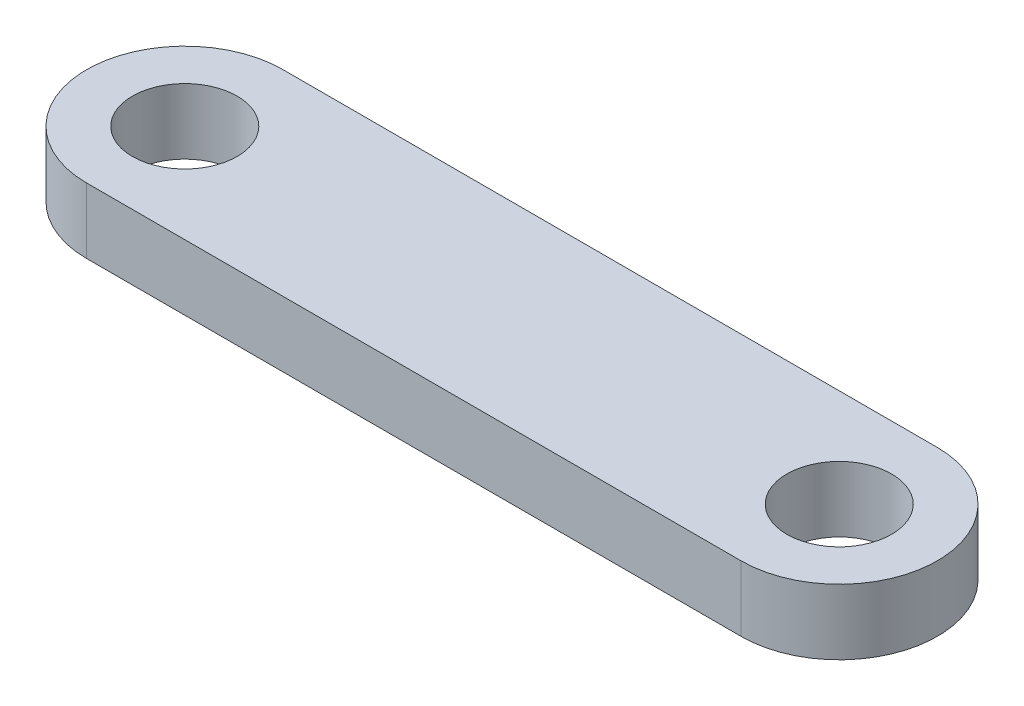
ISO-10303-21;
HEADER;
FILE_DESCRIPTION(('STEP AP214'),'2;1');
FILE_NAME('part.step','',(''),(''),'','','');
FILE_SCHEMA(('AUTOMOTIVE_DESIGN { 1 0 10303 214 1 1 1 1 }'));
ENDSEC;
DATA;
#1=APPLICATION_CONTEXT('core data for automotive mechanical design processes');
#2=APPLICATION_PROTOCOL_DEFINITION('international standard','automotive_design',2000,#1);
#3=PRODUCT_CONTEXT('',#1,'mechanical');
#4=PRODUCT('Part','Part','',(#3));
#5=PRODUCT_RELATED_PRODUCT_CATEGORY('part','',(#4));
#6=PRODUCT_DEFINITION_FORMATION('','',#4);
#7=PRODUCT_DEFINITION_CONTEXT('part definition',#1,'design');
#8=PRODUCT_DEFINITION('design','',#6,#7);
#9=PRODUCT_DEFINITION_SHAPE('','',#8);
#10=(LENGTH_UNIT() NAMED_UNIT(*) SI_UNIT(.MILLI.,.METRE.));
#11=(NAMED_UNIT(*) PLANE_ANGLE_UNIT() SI_UNIT($,.RADIAN.));
#12=(NAMED_UNIT(*) SI_UNIT($,.STERADIAN.) SOLID_ANGLE_UNIT());
#13=UNCERTAINTY_MEASURE_WITH_UNIT(LENGTH_MEASURE(1.E-05),#10,'distance_accuracy_value','');
#14=(GEOMETRIC_REPRESENTATION_CONTEXT(3) GLOBAL_UNCERTAINTY_ASSIGNED_CONTEXT((#13)) GLOBAL_UNIT_ASSIGNED_CONTEXT((#10,
#11,#12)) REPRESENTATION_CONTEXT('',''));
#15=CARTESIAN_POINT('',(0.,0.,0.));
#16=DIRECTION('',(0.,0.,1.));
#17=DIRECTION('',(1.,0.,0.));
#18=AXIS2_PLACEMENT_3D('',#15,#16,#17);
#19=CARTESIAN_POINT('',(7.5,4.25,0.));
#20=DIRECTION('',(0.,1.,0.));
#21=DIRECTION('',(0.,0.,1.));
#22=AXIS2_PLACEMENT_3D('',#19,#20,#21);
#23=PLANE('',#22);
#24=CARTESIAN_POINT('',(7.5,4.25,0.));
#25=DIRECTION('',(0.,1.,0.));
#26=DIRECTION('',(0.,0.,1.));
#27=AXIS2_PLACEMENT_3D('',#24,#25,#26);
#28=CIRCLE('',#27,2.8);
#29=CARTESIAN_POINT('',(7.5,4.25,2.8));
#30=VERTEX_POINT('',#29);
#31=EDGE_CURVE('E102',#30,#30,#28,.T.);
#32=ORIENTED_EDGE('',*,*,#31,.F.);
#33=EDGE_LOOP('',(#32));
#34=FACE_BOUND('',#33,.T.);
#35=CARTESIAN_POINT('',(7.5,4.25,0.));
#36=DIRECTION('',(0.,1.,0.));
#37=DIRECTION('',(0.,0.,1.));
#38=AXIS2_PLACEMENT_3D('',#35,#36,#37);
#39=CIRCLE('',#38,5.25);
#40=CARTESIAN_POINT('',(7.5,4.25,-5.25));
#41=VERTEX_POINT('',#40);
#42=CARTESIAN_POINT('',(7.5,4.25,5.25));
#43=VERTEX_POINT('',#42);
#44=EDGE_CURVE('E87',#41,#43,#39,.T.);
#45=ORIENTED_EDGE('',*,*,#44,.T.);
#46=DIRECTION('',(1.,0.,0.));
#47=VECTOR('',#46,1.);
#48=CARTESIAN_POINT('',(42.5,4.25,5.25));
#49=LINE('',#48,#47);
#50=CARTESIAN_POINT('',(42.5,4.25,5.25));
#51=VERTEX_POINT('',#50);
#52=EDGE_CURVE('E82',#43,#51,#49,.T.);
#53=ORIENTED_EDGE('',*,*,#52,.T.);
#54=CARTESIAN_POINT('',(42.5,4.25,0.));
#55=DIRECTION('',(0.,1.,0.));
#56=DIRECTION('',(0.,0.,1.));
#57=AXIS2_PLACEMENT_3D('',#54,#55,#56);
#58=CIRCLE('',#57,5.25);
#59=CARTESIAN_POINT('',(42.5,4.25,-5.25));
#60=VERTEX_POINT('',#59);
#61=EDGE_CURVE('E85',#51,#60,#58,.T.);
#62=ORIENTED_EDGE('',*,*,#61,.T.);
#63=DIRECTION('',(-1.,0.,0.));
#64=VECTOR('',#63,1.);
#65=CARTESIAN_POINT('',(7.5,4.25,-5.25));
#66=LINE('',#65,#64);
#67=EDGE_CURVE('E52',#60,#41,#66,.T.);
#68=ORIENTED_EDGE('',*,*,#67,.T.);
#69=EDGE_LOOP('',(#45,#53,#62,#68));
#70=FACE_BOUND('',#69,.T.);
#71=CARTESIAN_POINT('',(42.5,4.25,0.));
#72=DIRECTION('',(0.,1.,0.));
#73=DIRECTION('',(0.,0.,1.));
#74=AXIS2_PLACEMENT_3D('',#71,#72,#73);
#75=CIRCLE('',#74,2.8);
#76=CARTESIAN_POINT('',(42.5,4.25,2.8));
#77=VERTEX_POINT('',#76);
#78=EDGE_CURVE('E117',#77,#77,#75,.T.);
#79=ORIENTED_EDGE('',*,*,#78,.F.);
#80=EDGE_LOOP('',(#79));
#81=FACE_BOUND('',#80,.T.);
#82=ADVANCED_FACE('F35',(#34,#70,#81),#23,.T.);
#83=CARTESIAN_POINT('',(7.5,0.75,0.));
#84=DIRECTION('',(0.,1.,0.));
#85=DIRECTION('',(0.,0.,1.));
#86=AXIS2_PLACEMENT_3D('',#83,#84,#85);
#87=PLANE('',#86);
#88=CARTESIAN_POINT('',(7.5,0.75,0.));
#89=DIRECTION('',(0.,1.,0.));
#90=DIRECTION('',(0.,0.,1.));
#91=AXIS2_PLACEMENT_3D('',#88,#89,#90);
#92=CIRCLE('',#91,5.25);
#93=CARTESIAN_POINT('',(7.5,0.75,-5.25));
#94=VERTEX_POINT('',#93);
#95=CARTESIAN_POINT('',(7.5,0.75,5.25));
#96=VERTEX_POINT('',#95);
#97=EDGE_CURVE('E99',#94,#96,#92,.T.);
#98=ORIENTED_EDGE('',*,*,#97,.F.);
#99=DIRECTION('',(-1.,0.,0.));
#100=VECTOR('',#99,1.);
#101=CARTESIAN_POINT('',(7.5,0.75,-5.25));
#102=LINE('',#101,#100);
#103=CARTESIAN_POINT('',(42.5,0.75,-5.25));
#104=VERTEX_POINT('',#103);
#105=EDGE_CURVE('E75',#104,#94,#102,.T.);
#106=ORIENTED_EDGE('',*,*,#105,.F.);
#107=CARTESIAN_POINT('',(42.5,0.75,0.));
#108=DIRECTION('',(0.,1.,0.));
#109=DIRECTION('',(0.,0.,1.));
#110=AXIS2_PLACEMENT_3D('',#107,#108,#109);
#111=CIRCLE('',#110,5.25);
#112=CARTESIAN_POINT('',(42.5,0.75,5.25));
#113=VERTEX_POINT('',#112);
#114=EDGE_CURVE('E69',#113,#104,#111,.T.);
#115=ORIENTED_EDGE('',*,*,#114,.F.);
#116=DIRECTION('',(1.,0.,0.));
#117=VECTOR('',#116,1.);
#118=CARTESIAN_POINT('',(42.5,0.75,5.25));
#119=LINE('',#118,#117);
#120=EDGE_CURVE('E91',#96,#113,#119,.T.);
#121=ORIENTED_EDGE('',*,*,#120,.F.);
#122=EDGE_LOOP('',(#98,#106,#115,#121));
#123=FACE_BOUND('',#122,.T.);
#124=CARTESIAN_POINT('',(7.5,0.75,0.));
#125=DIRECTION('',(0.,1.,0.));
#126=DIRECTION('',(0.,0.,1.));
#127=AXIS2_PLACEMENT_3D('',#124,#125,#126);
#128=CIRCLE('',#127,2.8);
#129=CARTESIAN_POINT('',(7.5,0.75,2.8));
#130=VERTEX_POINT('',#129);
#131=EDGE_CURVE('E114',#130,#130,#128,.T.);
#132=ORIENTED_EDGE('',*,*,#131,.T.);
#133=EDGE_LOOP('',(#132));
#134=FACE_BOUND('',#133,.T.);
#135=CARTESIAN_POINT('',(42.5,0.75,0.));
#136=DIRECTION('',(0.,1.,0.));
#137=DIRECTION('',(0.,0.,1.));
#138=AXIS2_PLACEMENT_3D('',#135,#136,#137);
#139=CIRCLE('',#138,2.8);
#140=CARTESIAN_POINT('',(42.5,0.75,2.8));
#141=VERTEX_POINT('',#140);
#142=EDGE_CURVE('E120',#141,#141,#139,.T.);
#143=ORIENTED_EDGE('',*,*,#142,.T.);
#144=EDGE_LOOP('',(#143));
#145=FACE_BOUND('',#144,.T.);
#146=ADVANCED_FACE('F110',(#123,#134,#145),#87,.F.);
#147=CARTESIAN_POINT('',(7.5,4.25,0.));
#148=DIRECTION('',(0.,-1.,0.));
#149=DIRECTION('',(0.,0.,-1.));
#150=AXIS2_PLACEMENT_3D('',#147,#148,#149);
#151=CYLINDRICAL_SURFACE('',#150,5.25);
#152=ORIENTED_EDGE('',*,*,#97,.T.);
#153=DIRECTION('',(0.,-1.,0.));
#154=VECTOR('',#153,1.);
#155=CARTESIAN_POINT('',(7.5,4.25,5.25));
#156=LINE('',#155,#154);
#157=EDGE_CURVE('E11',#43,#96,#156,.T.);
#158=ORIENTED_EDGE('',*,*,#157,.F.);
#159=ORIENTED_EDGE('',*,*,#44,.F.);
#160=DIRECTION('',(0.,-1.,0.));
#161=VECTOR('',#160,1.);
#162=CARTESIAN_POINT('',(7.5,4.25,-5.25));
#163=LINE('',#162,#161);
#164=EDGE_CURVE('E95',#41,#94,#163,.T.);
#165=ORIENTED_EDGE('',*,*,#164,.T.);
#166=EDGE_LOOP('',(#152,#158,#159,#165));
#167=FACE_BOUND('',#166,.T.);
#168=ADVANCED_FACE('F37',(#167),#151,.T.);
#169=CARTESIAN_POINT('',(42.5,4.25,5.25));
#170=DIRECTION('',(0.,0.,-1.));
#171=DIRECTION('',(-1.,0.,0.));
#172=AXIS2_PLACEMENT_3D('',#169,#170,#171);
#173=PLANE('',#172);
#174=ORIENTED_EDGE('',*,*,#120,.T.);
#175=DIRECTION('',(0.,-1.,0.));
#176=VECTOR('',#175,1.);
#177=CARTESIAN_POINT('',(42.5,4.25,5.25));
#178=LINE('',#177,#176);
#179=EDGE_CURVE('E44',#51,#113,#178,.T.);
#180=ORIENTED_EDGE('',*,*,#179,.F.);
#181=ORIENTED_EDGE('',*,*,#52,.F.);
#182=ORIENTED_EDGE('',*,*,#157,.T.);
#183=EDGE_LOOP('',(#174,#180,#181,#182));
#184=FACE_BOUND('',#183,.T.);
#185=ADVANCED_FACE('F90',(#184),#173,.F.);
#186=CARTESIAN_POINT('',(42.5,4.25,0.));
#187=DIRECTION('',(0.,-1.,0.));
#188=DIRECTION('',(0.,0.,-1.));
#189=AXIS2_PLACEMENT_3D('',#186,#187,#188);
#190=CYLINDRICAL_SURFACE('',#189,5.25);
#191=ORIENTED_EDGE('',*,*,#114,.T.);
#192=DIRECTION('',(0.,-1.,0.));
#193=VECTOR('',#192,1.);
#194=CARTESIAN_POINT('',(42.5,4.25,-5.25));
#195=LINE('',#194,#193);
#196=EDGE_CURVE('E92',#60,#104,#195,.T.);
#197=ORIENTED_EDGE('',*,*,#196,.F.);
#198=ORIENTED_EDGE('',*,*,#61,.F.);
#199=ORIENTED_EDGE('',*,*,#179,.T.);
#200=EDGE_LOOP('',(#191,#197,#198,#199));
#201=FACE_BOUND('',#200,.T.);
#202=ADVANCED_FACE('F93',(#201),#190,.T.);
#203=CARTESIAN_POINT('',(7.5,4.25,-5.25));
#204=DIRECTION('',(0.,0.,1.));
#205=DIRECTION('',(1.,0.,0.));
#206=AXIS2_PLACEMENT_3D('',#203,#204,#205);
#207=PLANE('',#206);
#208=ORIENTED_EDGE('',*,*,#105,.T.);
#209=ORIENTED_EDGE('',*,*,#164,.F.);
#210=ORIENTED_EDGE('',*,*,#67,.F.);
#211=ORIENTED_EDGE('',*,*,#196,.T.);
#212=EDGE_LOOP('',(#208,#209,#210,#211));
#213=FACE_BOUND('',#212,.T.);
#214=ADVANCED_FACE('F107',(#213),#207,.F.);
#215=CARTESIAN_POINT('',(7.5,4.25,0.));
#216=DIRECTION('',(0.,-1.,0.));
#217=DIRECTION('',(0.,0.,-1.));
#218=AXIS2_PLACEMENT_3D('',#215,#216,#217);
#219=CYLINDRICAL_SURFACE('',#218,2.8);
#220=ORIENTED_EDGE('',*,*,#31,.T.);
#221=EDGE_LOOP('',(#220));
#222=FACE_BOUND('',#221,.T.);
#223=ORIENTED_EDGE('',*,*,#131,.F.);
#224=EDGE_LOOP('',(#223));
#225=FACE_BOUND('',#224,.T.);
#226=ADVANCED_FACE('F137',(#222,#225),#219,.F.);
#227=CARTESIAN_POINT('',(42.5,4.25,0.));
#228=DIRECTION('',(0.,-1.,0.));
#229=DIRECTION('',(0.,0.,-1.));
#230=AXIS2_PLACEMENT_3D('',#227,#228,#229);
#231=CYLINDRICAL_SURFACE('',#230,2.8);
#232=ORIENTED_EDGE('',*,*,#78,.T.);
#233=EDGE_LOOP('',(#232));
#234=FACE_BOUND('',#233,.T.);
#235=ORIENTED_EDGE('',*,*,#142,.F.);
#236=EDGE_LOOP('',(#235));
#237=FACE_BOUND('',#236,.T.);
#238=ADVANCED_FACE('F126',(#234,#237),#231,.F.);
#239=CLOSED_SHELL('',(#82,#146,#168,#185,#202,#214,#226,#238));
#240=MANIFOLD_SOLID_BREP('B2',#239);
#241=ADVANCED_BREP_SHAPE_REPRESENTATION('',(#18,#240),#14);
#242=SHAPE_DEFINITION_REPRESENTATION(#9,#241);
ENDSEC;
END-ISO-10303-21;
